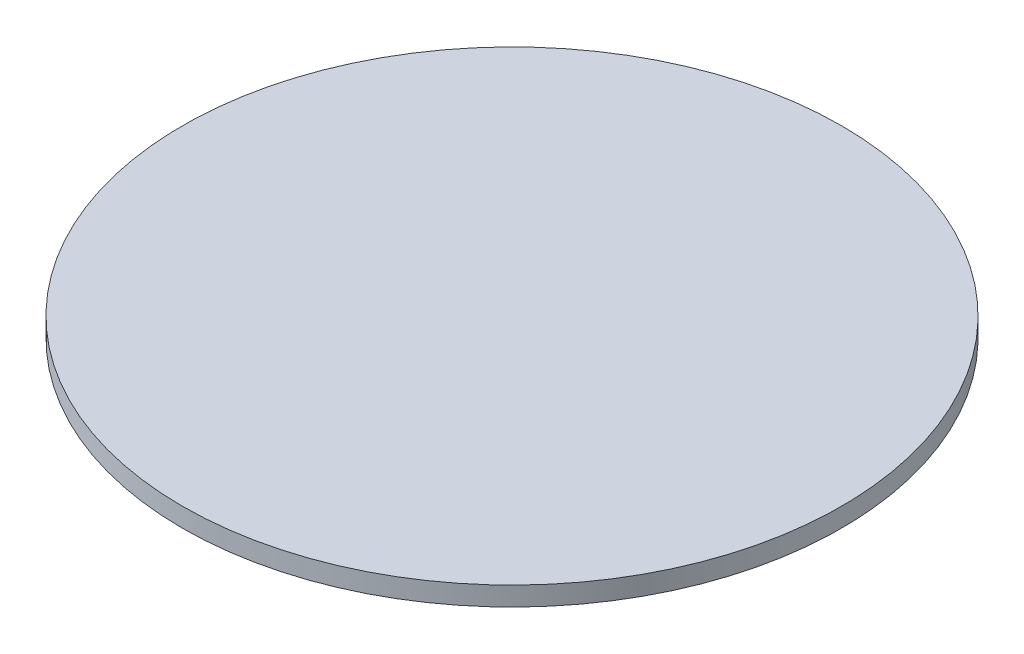
ISO-10303-21;
HEADER;
FILE_DESCRIPTION(('STEP AP214'),'2;1');
FILE_NAME('part.step','',(''),(''),'','','');
FILE_SCHEMA(('AUTOMOTIVE_DESIGN { 1 0 10303 214 1 1 1 1 }'));
ENDSEC;
DATA;
#1=APPLICATION_CONTEXT('core data for automotive mechanical design processes');
#2=APPLICATION_PROTOCOL_DEFINITION('international standard','automotive_design',2000,#1);
#3=PRODUCT_CONTEXT('',#1,'mechanical');
#4=PRODUCT('Part','Part','',(#3));
#5=PRODUCT_RELATED_PRODUCT_CATEGORY('part','',(#4));
#6=PRODUCT_DEFINITION_FORMATION('','',#4);
#7=PRODUCT_DEFINITION_CONTEXT('part definition',#1,'design');
#8=PRODUCT_DEFINITION('design','',#6,#7);
#9=PRODUCT_DEFINITION_SHAPE('','',#8);
#10=(LENGTH_UNIT() NAMED_UNIT(*) SI_UNIT(.MILLI.,.METRE.));
#11=(NAMED_UNIT(*) PLANE_ANGLE_UNIT() SI_UNIT($,.RADIAN.));
#12=(NAMED_UNIT(*) SI_UNIT($,.STERADIAN.) SOLID_ANGLE_UNIT());
#13=UNCERTAINTY_MEASURE_WITH_UNIT(LENGTH_MEASURE(1.E-05),#10,'distance_accuracy_value','');
#14=(GEOMETRIC_REPRESENTATION_CONTEXT(3) GLOBAL_UNCERTAINTY_ASSIGNED_CONTEXT((#13)) GLOBAL_UNIT_ASSIGNED_CONTEXT((#10,
#11,#12)) REPRESENTATION_CONTEXT('',''));
#15=CARTESIAN_POINT('',(0.,0.,0.));
#16=DIRECTION('',(0.,0.,1.));
#17=DIRECTION('',(1.,0.,0.));
#18=AXIS2_PLACEMENT_3D('',#15,#16,#17);
#19=CARTESIAN_POINT('',(0.,2.54,0.));
#20=DIRECTION('',(0.,-1.,0.));
#21=DIRECTION('',(0.,0.,-1.));
#22=AXIS2_PLACEMENT_3D('',#19,#20,#21);
#23=CYLINDRICAL_SURFACE('',#22,43.9506021284442);
#24=CARTESIAN_POINT('',(0.,2.54,0.));
#25=DIRECTION('',(0.,1.,0.));
#26=DIRECTION('',(0.,0.,1.));
#27=AXIS2_PLACEMENT_3D('',#24,#25,#26);
#28=CIRCLE('',#27,43.9506021284442);
#29=CARTESIAN_POINT('',(0.,2.54,43.9506021284442));
#30=VERTEX_POINT('',#29);
#31=EDGE_CURVE('E10',#30,#30,#28,.T.);
#32=ORIENTED_EDGE('',*,*,#31,.F.);
#33=EDGE_LOOP('',(#32));
#34=FACE_BOUND('',#33,.T.);
#35=CARTESIAN_POINT('',(0.,0.,0.));
#36=DIRECTION('',(0.,1.,0.));
#37=DIRECTION('',(0.,0.,1.));
#38=AXIS2_PLACEMENT_3D('',#35,#36,#37);
#39=CIRCLE('',#38,43.9506021284442);
#40=CARTESIAN_POINT('',(0.,0.,43.9506021284442));
#41=VERTEX_POINT('',#40);
#42=EDGE_CURVE('E34',#41,#41,#39,.T.);
#43=ORIENTED_EDGE('',*,*,#42,.T.);
#44=EDGE_LOOP('',(#43));
#45=FACE_BOUND('',#44,.T.);
#46=ADVANCED_FACE('F31',(#34,#45),#23,.T.);
#47=CARTESIAN_POINT('',(0.,2.54,0.));
#48=DIRECTION('',(0.,1.,0.));
#49=DIRECTION('',(0.,0.,1.));
#50=AXIS2_PLACEMENT_3D('',#47,#48,#49);
#51=PLANE('',#50);
#52=ORIENTED_EDGE('',*,*,#31,.T.);
#53=EDGE_LOOP('',(#52));
#54=FACE_BOUND('',#53,.T.);
#55=ADVANCED_FACE('F46',(#54),#51,.T.);
#56=CARTESIAN_POINT('',(0.,0.,0.));
#57=DIRECTION('',(0.,1.,0.));
#58=DIRECTION('',(0.,0.,1.));
#59=AXIS2_PLACEMENT_3D('',#56,#57,#58);
#60=PLANE('',#59);
#61=ORIENTED_EDGE('',*,*,#42,.F.);
#62=EDGE_LOOP('',(#61));
#63=FACE_BOUND('',#62,.T.);
#64=ADVANCED_FACE('F44',(#63),#60,.F.);
#65=CLOSED_SHELL('',(#46,#55,#64));
#66=MANIFOLD_SOLID_BREP('B2',#65);
#67=ADVANCED_BREP_SHAPE_REPRESENTATION('',(#18,#66),#14);
#68=SHAPE_DEFINITION_REPRESENTATION(#9,#67);
ENDSEC;
END-ISO-10303-21;
